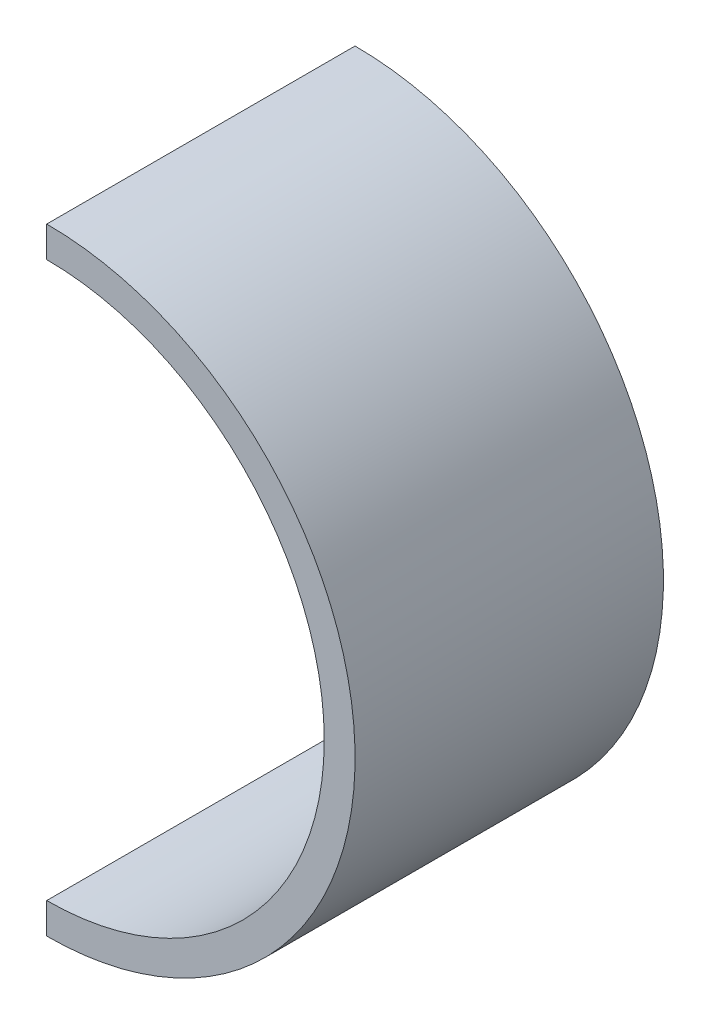
ISO-10303-21;
HEADER;
FILE_DESCRIPTION(('STEP AP214'),'2;1');
FILE_NAME('part.step','',(''),(''),'','','');
FILE_SCHEMA(('AUTOMOTIVE_DESIGN { 1 0 10303 214 1 1 1 1 }'));
ENDSEC;
DATA;
#1=APPLICATION_CONTEXT('core data for automotive mechanical design processes');
#2=APPLICATION_PROTOCOL_DEFINITION('international standard','automotive_design',2000,#1);
#3=PRODUCT_CONTEXT('',#1,'mechanical');
#4=PRODUCT('Part','Part','',(#3));
#5=PRODUCT_RELATED_PRODUCT_CATEGORY('part','',(#4));
#6=PRODUCT_DEFINITION_FORMATION('','',#4);
#7=PRODUCT_DEFINITION_CONTEXT('part definition',#1,'design');
#8=PRODUCT_DEFINITION('design','',#6,#7);
#9=PRODUCT_DEFINITION_SHAPE('','',#8);
#10=(LENGTH_UNIT() NAMED_UNIT(*) SI_UNIT(.MILLI.,.METRE.));
#11=(NAMED_UNIT(*) PLANE_ANGLE_UNIT() SI_UNIT($,.RADIAN.));
#12=(NAMED_UNIT(*) SI_UNIT($,.STERADIAN.) SOLID_ANGLE_UNIT());
#13=UNCERTAINTY_MEASURE_WITH_UNIT(LENGTH_MEASURE(1.E-05),#10,'distance_accuracy_value','');
#14=(GEOMETRIC_REPRESENTATION_CONTEXT(3) GLOBAL_UNCERTAINTY_ASSIGNED_CONTEXT((#13)) GLOBAL_UNIT_ASSIGNED_CONTEXT((#10,
#11,#12)) REPRESENTATION_CONTEXT('',''));
#15=CARTESIAN_POINT('',(0.,0.,0.));
#16=DIRECTION('',(0.,0.,1.));
#17=DIRECTION('',(1.,0.,0.));
#18=AXIS2_PLACEMENT_3D('',#15,#16,#17);
#19=CARTESIAN_POINT('',(0.,0.,25.));
#20=DIRECTION('',(0.,0.,-1.));
#21=DIRECTION('',(-1.,0.,0.));
#22=AXIS2_PLACEMENT_3D('',#19,#20,#21);
#23=CYLINDRICAL_SURFACE('',#22,45.);
#24=CARTESIAN_POINT('',(0.,0.,-25.));
#25=DIRECTION('',(0.,0.,-1.));
#26=DIRECTION('',(1.,0.,0.));
#27=AXIS2_PLACEMENT_3D('',#24,#25,#26);
#28=CIRCLE('',#27,45.);
#29=CARTESIAN_POINT('',(0.,45.,-25.));
#30=VERTEX_POINT('',#29);
#31=CARTESIAN_POINT('',(0.,-45.,-25.));
#32=VERTEX_POINT('',#31);
#33=EDGE_CURVE('E111',#30,#32,#28,.T.);
#34=ORIENTED_EDGE('',*,*,#33,.T.);
#35=DIRECTION('',(0.,0.,-1.));
#36=VECTOR('',#35,1.);
#37=CARTESIAN_POINT('',(0.,-45.,25.));
#38=LINE('',#37,#36);
#39=CARTESIAN_POINT('',(0.,-45.,25.));
#40=VERTEX_POINT('',#39);
#41=EDGE_CURVE('E11',#40,#32,#38,.T.);
#42=ORIENTED_EDGE('',*,*,#41,.F.);
#43=CARTESIAN_POINT('',(0.,0.,25.));
#44=DIRECTION('',(0.,0.,-1.));
#45=DIRECTION('',(1.,0.,0.));
#46=AXIS2_PLACEMENT_3D('',#43,#44,#45);
#47=CIRCLE('',#46,45.);
#48=CARTESIAN_POINT('',(0.,45.,25.));
#49=VERTEX_POINT('',#48);
#50=EDGE_CURVE('E95',#49,#40,#47,.T.);
#51=ORIENTED_EDGE('',*,*,#50,.F.);
#52=DIRECTION('',(0.,0.,-1.));
#53=VECTOR('',#52,1.);
#54=CARTESIAN_POINT('',(0.,45.,25.));
#55=LINE('',#54,#53);
#56=EDGE_CURVE('E107',#49,#30,#55,.T.);
#57=ORIENTED_EDGE('',*,*,#56,.T.);
#58=EDGE_LOOP('',(#34,#42,#51,#57));
#59=FACE_BOUND('',#58,.T.);
#60=ADVANCED_FACE('F43',(#59),#23,.F.);
#61=CARTESIAN_POINT('',(0.,-45.,25.));
#62=DIRECTION('',(1.,0.,0.));
#63=DIRECTION('',(0.,0.,-1.));
#64=AXIS2_PLACEMENT_3D('',#61,#62,#63);
#65=PLANE('',#64);
#66=DIRECTION('',(0.,-1.,0.));
#67=VECTOR('',#66,1.);
#68=CARTESIAN_POINT('',(0.,-45.,-25.));
#69=LINE('',#68,#67);
#70=CARTESIAN_POINT('',(0.,-50.,-25.));
#71=VERTEX_POINT('',#70);
#72=EDGE_CURVE('E100',#32,#71,#69,.T.);
#73=ORIENTED_EDGE('',*,*,#72,.T.);
#74=DIRECTION('',(0.,0.,-1.));
#75=VECTOR('',#74,1.);
#76=CARTESIAN_POINT('',(0.,-50.,25.));
#77=LINE('',#76,#75);
#78=CARTESIAN_POINT('',(0.,-50.,25.));
#79=VERTEX_POINT('',#78);
#80=EDGE_CURVE('E52',#79,#71,#77,.T.);
#81=ORIENTED_EDGE('',*,*,#80,.F.);
#82=DIRECTION('',(0.,-1.,0.));
#83=VECTOR('',#82,1.);
#84=CARTESIAN_POINT('',(0.,-45.,25.));
#85=LINE('',#84,#83);
#86=EDGE_CURVE('E90',#40,#79,#85,.T.);
#87=ORIENTED_EDGE('',*,*,#86,.F.);
#88=ORIENTED_EDGE('',*,*,#41,.T.);
#89=EDGE_LOOP('',(#73,#81,#87,#88));
#90=FACE_BOUND('',#89,.T.);
#91=ADVANCED_FACE('F99',(#90),#65,.F.);
#92=CARTESIAN_POINT('',(0.,0.,25.));
#93=DIRECTION('',(0.,0.,-1.));
#94=DIRECTION('',(-1.,0.,0.));
#95=AXIS2_PLACEMENT_3D('',#92,#93,#94);
#96=CYLINDRICAL_SURFACE('',#95,50.);
#97=CARTESIAN_POINT('',(0.,0.,-25.));
#98=DIRECTION('',(0.,0.,1.));
#99=DIRECTION('',(1.,0.,0.));
#100=AXIS2_PLACEMENT_3D('',#97,#98,#99);
#101=CIRCLE('',#100,50.);
#102=CARTESIAN_POINT('',(0.,50.,-25.));
#103=VERTEX_POINT('',#102);
#104=EDGE_CURVE('E77',#71,#103,#101,.T.);
#105=ORIENTED_EDGE('',*,*,#104,.T.);
#106=DIRECTION('',(0.,0.,-1.));
#107=VECTOR('',#106,1.);
#108=CARTESIAN_POINT('',(0.,50.,25.));
#109=LINE('',#108,#107);
#110=CARTESIAN_POINT('',(0.,50.,25.));
#111=VERTEX_POINT('',#110);
#112=EDGE_CURVE('E102',#111,#103,#109,.T.);
#113=ORIENTED_EDGE('',*,*,#112,.F.);
#114=CARTESIAN_POINT('',(0.,0.,25.));
#115=DIRECTION('',(0.,0.,1.));
#116=DIRECTION('',(1.,0.,0.));
#117=AXIS2_PLACEMENT_3D('',#114,#115,#116);
#118=CIRCLE('',#117,50.);
#119=EDGE_CURVE('E93',#79,#111,#118,.T.);
#120=ORIENTED_EDGE('',*,*,#119,.F.);
#121=ORIENTED_EDGE('',*,*,#80,.T.);
#122=EDGE_LOOP('',(#105,#113,#120,#121));
#123=FACE_BOUND('',#122,.T.);
#124=ADVANCED_FACE('F103',(#123),#96,.T.);
#125=CARTESIAN_POINT('',(0.,45.,25.));
#126=DIRECTION('',(1.,0.,0.));
#127=DIRECTION('',(0.,0.,-1.));
#128=AXIS2_PLACEMENT_3D('',#125,#126,#127);
#129=PLANE('',#128);
#130=DIRECTION('',(0.,-1.,0.));
#131=VECTOR('',#130,1.);
#132=CARTESIAN_POINT('',(0.,45.,-25.));
#133=LINE('',#132,#131);
#134=EDGE_CURVE('E83',#103,#30,#133,.T.);
#135=ORIENTED_EDGE('',*,*,#134,.T.);
#136=ORIENTED_EDGE('',*,*,#56,.F.);
#137=DIRECTION('',(0.,-1.,0.));
#138=VECTOR('',#137,1.);
#139=CARTESIAN_POINT('',(0.,45.,25.));
#140=LINE('',#139,#138);
#141=EDGE_CURVE('E60',#111,#49,#140,.T.);
#142=ORIENTED_EDGE('',*,*,#141,.F.);
#143=ORIENTED_EDGE('',*,*,#112,.T.);
#144=EDGE_LOOP('',(#135,#136,#142,#143));
#145=FACE_BOUND('',#144,.T.);
#146=ADVANCED_FACE('F124',(#145),#129,.F.);
#147=CARTESIAN_POINT('',(0.,0.,25.));
#148=DIRECTION('',(0.,0.,1.));
#149=DIRECTION('',(1.,0.,0.));
#150=AXIS2_PLACEMENT_3D('',#147,#148,#149);
#151=PLANE('',#150);
#152=ORIENTED_EDGE('',*,*,#50,.T.);
#153=ORIENTED_EDGE('',*,*,#86,.T.);
#154=ORIENTED_EDGE('',*,*,#119,.T.);
#155=ORIENTED_EDGE('',*,*,#141,.T.);
#156=EDGE_LOOP('',(#152,#153,#154,#155));
#157=FACE_BOUND('',#156,.T.);
#158=ADVANCED_FACE('F91',(#157),#151,.T.);
#159=CARTESIAN_POINT('',(0.,0.,-25.));
#160=DIRECTION('',(0.,0.,1.));
#161=DIRECTION('',(1.,0.,0.));
#162=AXIS2_PLACEMENT_3D('',#159,#160,#161);
#163=PLANE('',#162);
#164=ORIENTED_EDGE('',*,*,#33,.F.);
#165=ORIENTED_EDGE('',*,*,#134,.F.);
#166=ORIENTED_EDGE('',*,*,#104,.F.);
#167=ORIENTED_EDGE('',*,*,#72,.F.);
#168=EDGE_LOOP('',(#164,#165,#166,#167));
#169=FACE_BOUND('',#168,.T.);
#170=ADVANCED_FACE('F127',(#169),#163,.F.);
#171=CLOSED_SHELL('',(#60,#91,#124,#146,#158,#170));
#172=MANIFOLD_SOLID_BREP('B2',#171);
#173=ADVANCED_BREP_SHAPE_REPRESENTATION('',(#18,#172),#14);
#174=SHAPE_DEFINITION_REPRESENTATION(#9,#173);
ENDSEC;
END-ISO-10303-21;
